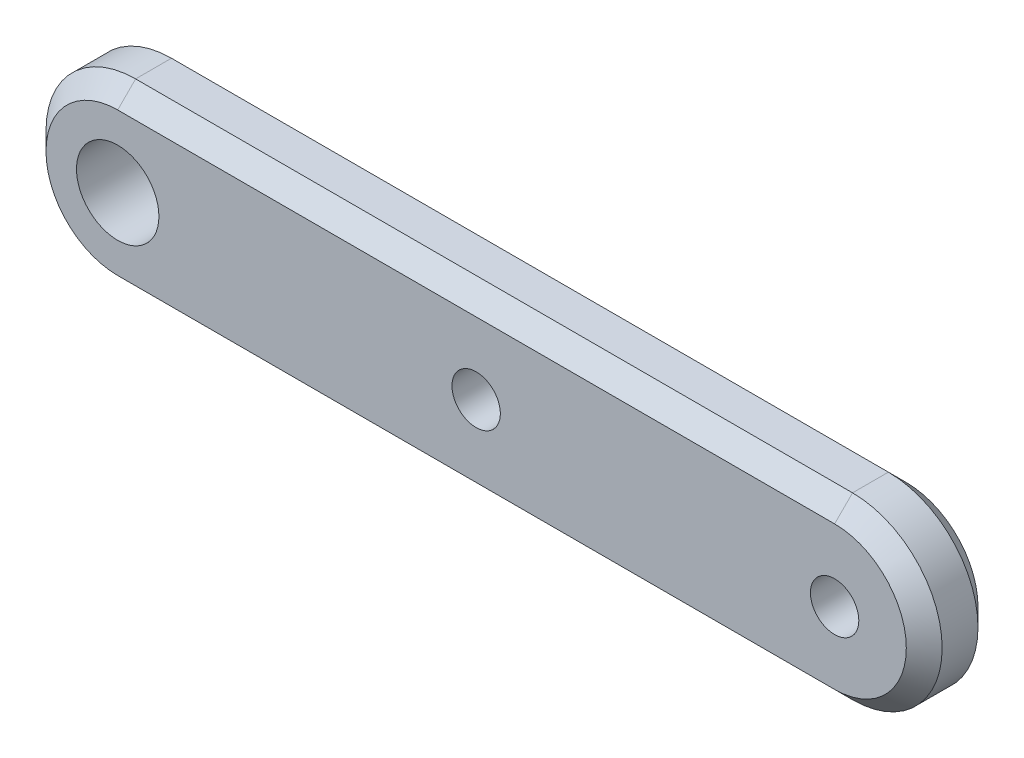
ISO-10303-21;
HEADER;
FILE_DESCRIPTION(('STEP AP214'),'2;1');
FILE_NAME('part.step','',(''),(''),'','','');
FILE_SCHEMA(('AUTOMOTIVE_DESIGN { 1 0 10303 214 1 1 1 1 }'));
ENDSEC;
DATA;
#1=APPLICATION_CONTEXT('core data for automotive mechanical design processes');
#2=APPLICATION_PROTOCOL_DEFINITION('international standard','automotive_design',2000,#1);
#3=PRODUCT_CONTEXT('',#1,'mechanical');
#4=PRODUCT('Part','Part','',(#3));
#5=PRODUCT_RELATED_PRODUCT_CATEGORY('part','',(#4));
#6=PRODUCT_DEFINITION_FORMATION('','',#4);
#7=PRODUCT_DEFINITION_CONTEXT('part definition',#1,'design');
#8=PRODUCT_DEFINITION('design','',#6,#7);
#9=PRODUCT_DEFINITION_SHAPE('','',#8);
#10=(LENGTH_UNIT() NAMED_UNIT(*) SI_UNIT(.MILLI.,.METRE.));
#11=(NAMED_UNIT(*) PLANE_ANGLE_UNIT() SI_UNIT($,.RADIAN.));
#12=(NAMED_UNIT(*) SI_UNIT($,.STERADIAN.) SOLID_ANGLE_UNIT());
#13=UNCERTAINTY_MEASURE_WITH_UNIT(LENGTH_MEASURE(1.E-05),#10,'distance_accuracy_value','');
#14=(GEOMETRIC_REPRESENTATION_CONTEXT(3) GLOBAL_UNCERTAINTY_ASSIGNED_CONTEXT((#13)) GLOBAL_UNIT_ASSIGNED_CONTEXT((#10,
#11,#12)) REPRESENTATION_CONTEXT('',''));
#15=CARTESIAN_POINT('',(0.,0.,0.));
#16=DIRECTION('',(0.,0.,1.));
#17=DIRECTION('',(1.,0.,0.));
#18=AXIS2_PLACEMENT_3D('',#15,#16,#17);
#19=CARTESIAN_POINT('',(0.,-5.,4.));
#20=DIRECTION('',(0.,-1.,0.));
#21=DIRECTION('',(0.,0.,-1.));
#22=AXIS2_PLACEMENT_3D('',#19,#20,#21);
#23=PLANE('',#22);
#24=DIRECTION('',(0.,0.,-1.));
#25=VECTOR('',#24,1.);
#26=CARTESIAN_POINT('',(0.,-5.,4.));
#27=LINE('',#26,#25);
#28=CARTESIAN_POINT('',(0.,-5.,3.));
#29=VERTEX_POINT('',#28);
#30=CARTESIAN_POINT('',(0.,-5.,1.));
#31=VERTEX_POINT('',#30);
#32=EDGE_CURVE('E183',#29,#31,#27,.T.);
#33=ORIENTED_EDGE('',*,*,#32,.T.);
#34=DIRECTION('',(1.,0.,0.));
#35=VECTOR('',#34,1.);
#36=CARTESIAN_POINT('',(40.,-5.,1.));
#37=LINE('',#36,#35);
#38=CARTESIAN_POINT('',(40.,-5.,1.));
#39=VERTEX_POINT('',#38);
#40=EDGE_CURVE('E167',#31,#39,#37,.T.);
#41=ORIENTED_EDGE('',*,*,#40,.T.);
#42=DIRECTION('',(0.,0.,-1.));
#43=VECTOR('',#42,1.);
#44=CARTESIAN_POINT('',(40.,-5.,4.));
#45=LINE('',#44,#43);
#46=CARTESIAN_POINT('',(40.,-5.,3.));
#47=VERTEX_POINT('',#46);
#48=EDGE_CURVE('E125',#47,#39,#45,.T.);
#49=ORIENTED_EDGE('',*,*,#48,.F.);
#50=DIRECTION('',(-1.,0.,0.));
#51=VECTOR('',#50,1.);
#52=CARTESIAN_POINT('',(0.,-5.,3.));
#53=LINE('',#52,#51);
#54=EDGE_CURVE('E170',#47,#29,#53,.T.);
#55=ORIENTED_EDGE('',*,*,#54,.T.);
#56=EDGE_LOOP('',(#33,#41,#49,#55));
#57=FACE_BOUND('',#56,.T.);
#58=ADVANCED_FACE('F36',(#57),#23,.T.);
#59=CARTESIAN_POINT('',(40.,0.,4.));
#60=DIRECTION('',(0.,0.,-1.));
#61=DIRECTION('',(-1.,0.,0.));
#62=AXIS2_PLACEMENT_3D('',#59,#60,#61);
#63=CYLINDRICAL_SURFACE('',#62,5.);
#64=ORIENTED_EDGE('',*,*,#48,.T.);
#65=CARTESIAN_POINT('',(40.,0.,1.));
#66=DIRECTION('',(0.,0.,1.));
#67=DIRECTION('',(1.,0.,0.));
#68=AXIS2_PLACEMENT_3D('',#65,#66,#67);
#69=CIRCLE('',#68,5.);
#70=CARTESIAN_POINT('',(40.,5.,1.));
#71=VERTEX_POINT('',#70);
#72=EDGE_CURVE('E160',#39,#71,#69,.T.);
#73=ORIENTED_EDGE('',*,*,#72,.T.);
#74=DIRECTION('',(0.,0.,-1.));
#75=VECTOR('',#74,1.);
#76=CARTESIAN_POINT('',(40.,5.,4.));
#77=LINE('',#76,#75);
#78=CARTESIAN_POINT('',(40.,5.,3.));
#79=VERTEX_POINT('',#78);
#80=EDGE_CURVE('E177',#79,#71,#77,.T.);
#81=ORIENTED_EDGE('',*,*,#80,.F.);
#82=CARTESIAN_POINT('',(40.,0.,3.));
#83=DIRECTION('',(0.,0.,1.));
#84=DIRECTION('',(1.,0.,0.));
#85=AXIS2_PLACEMENT_3D('',#82,#83,#84);
#86=CIRCLE('',#85,5.);
#87=EDGE_CURVE('E162',#79,#47,#86,.F.);
#88=ORIENTED_EDGE('',*,*,#87,.T.);
#89=EDGE_LOOP('',(#64,#73,#81,#88));
#90=FACE_BOUND('',#89,.T.);
#91=ADVANCED_FACE('F230',(#90),#63,.T.);
#92=CARTESIAN_POINT('',(0.,5.,4.));
#93=DIRECTION('',(0.,1.,0.));
#94=DIRECTION('',(0.,0.,1.));
#95=AXIS2_PLACEMENT_3D('',#92,#93,#94);
#96=PLANE('',#95);
#97=ORIENTED_EDGE('',*,*,#80,.T.);
#98=DIRECTION('',(-1.,0.,0.));
#99=VECTOR('',#98,1.);
#100=CARTESIAN_POINT('',(0.,5.,1.));
#101=LINE('',#100,#99);
#102=CARTESIAN_POINT('',(0.,5.,1.));
#103=VERTEX_POINT('',#102);
#104=EDGE_CURVE('E156',#71,#103,#101,.T.);
#105=ORIENTED_EDGE('',*,*,#104,.T.);
#106=DIRECTION('',(0.,0.,-1.));
#107=VECTOR('',#106,1.);
#108=CARTESIAN_POINT('',(0.,5.,4.));
#109=LINE('',#108,#107);
#110=CARTESIAN_POINT('',(0.,5.,3.));
#111=VERTEX_POINT('',#110);
#112=EDGE_CURVE('E180',#111,#103,#109,.T.);
#113=ORIENTED_EDGE('',*,*,#112,.F.);
#114=DIRECTION('',(1.,0.,0.));
#115=VECTOR('',#114,1.);
#116=CARTESIAN_POINT('',(0.,5.,3.));
#117=LINE('',#116,#115);
#118=EDGE_CURVE('E158',#111,#79,#117,.T.);
#119=ORIENTED_EDGE('',*,*,#118,.T.);
#120=EDGE_LOOP('',(#97,#105,#113,#119));
#121=FACE_BOUND('',#120,.T.);
#122=ADVANCED_FACE('F236',(#121),#96,.T.);
#123=CARTESIAN_POINT('',(40.,0.,4.));
#124=DIRECTION('',(0.,0.,-1.));
#125=DIRECTION('',(-1.,0.,0.));
#126=AXIS2_PLACEMENT_3D('',#123,#124,#125);
#127=CYLINDRICAL_SURFACE('',#126,1.35);
#128=CARTESIAN_POINT('',(40.,0.,4.));
#129=DIRECTION('',(0.,0.,1.));
#130=DIRECTION('',(1.,0.,0.));
#131=AXIS2_PLACEMENT_3D('',#128,#129,#130);
#132=CIRCLE('',#131,1.35);
#133=CARTESIAN_POINT('',(41.35,0.,4.));
#134=VERTEX_POINT('',#133);
#135=EDGE_CURVE('E198',#134,#134,#132,.T.);
#136=ORIENTED_EDGE('',*,*,#135,.T.);
#137=EDGE_LOOP('',(#136));
#138=FACE_BOUND('',#137,.T.);
#139=CARTESIAN_POINT('',(40.,0.,0.));
#140=DIRECTION('',(0.,0.,1.));
#141=DIRECTION('',(1.,0.,0.));
#142=AXIS2_PLACEMENT_3D('',#139,#140,#141);
#143=CIRCLE('',#142,1.35);
#144=CARTESIAN_POINT('',(41.35,0.,0.));
#145=VERTEX_POINT('',#144);
#146=EDGE_CURVE('E191',#145,#145,#143,.T.);
#147=ORIENTED_EDGE('',*,*,#146,.F.);
#148=EDGE_LOOP('',(#147));
#149=FACE_BOUND('',#148,.T.);
#150=ADVANCED_FACE('F278',(#138,#149),#127,.F.);
#151=CARTESIAN_POINT('',(20.,0.,4.));
#152=DIRECTION('',(0.,0.,-1.));
#153=DIRECTION('',(-1.,0.,0.));
#154=AXIS2_PLACEMENT_3D('',#151,#152,#153);
#155=CYLINDRICAL_SURFACE('',#154,1.35);
#156=CARTESIAN_POINT('',(20.,0.,4.));
#157=DIRECTION('',(0.,0.,1.));
#158=DIRECTION('',(1.,0.,0.));
#159=AXIS2_PLACEMENT_3D('',#156,#157,#158);
#160=CIRCLE('',#159,1.35);
#161=CARTESIAN_POINT('',(21.35,0.,4.));
#162=VERTEX_POINT('',#161);
#163=EDGE_CURVE('E190',#162,#162,#160,.T.);
#164=ORIENTED_EDGE('',*,*,#163,.T.);
#165=EDGE_LOOP('',(#164));
#166=FACE_BOUND('',#165,.T.);
#167=CARTESIAN_POINT('',(20.,0.,0.));
#168=DIRECTION('',(0.,0.,1.));
#169=DIRECTION('',(1.,0.,0.));
#170=AXIS2_PLACEMENT_3D('',#167,#168,#169);
#171=CIRCLE('',#170,1.35);
#172=CARTESIAN_POINT('',(21.35,0.,0.));
#173=VERTEX_POINT('',#172);
#174=EDGE_CURVE('E131',#173,#173,#171,.T.);
#175=ORIENTED_EDGE('',*,*,#174,.F.);
#176=EDGE_LOOP('',(#175));
#177=FACE_BOUND('',#176,.T.);
#178=ADVANCED_FACE('F204',(#166,#177),#155,.F.);
#179=CARTESIAN_POINT('',(0.,0.,4.));
#180=DIRECTION('',(0.,0.,-1.));
#181=DIRECTION('',(-1.,0.,0.));
#182=AXIS2_PLACEMENT_3D('',#179,#180,#181);
#183=CYLINDRICAL_SURFACE('',#182,5.);
#184=ORIENTED_EDGE('',*,*,#112,.T.);
#185=CARTESIAN_POINT('',(0.,0.,1.));
#186=DIRECTION('',(0.,0.,1.));
#187=DIRECTION('',(1.,0.,0.));
#188=AXIS2_PLACEMENT_3D('',#185,#186,#187);
#189=CIRCLE('',#188,5.);
#190=EDGE_CURVE('E128',#103,#31,#189,.T.);
#191=ORIENTED_EDGE('',*,*,#190,.T.);
#192=ORIENTED_EDGE('',*,*,#32,.F.);
#193=CARTESIAN_POINT('',(0.,0.,3.));
#194=DIRECTION('',(0.,0.,1.));
#195=DIRECTION('',(1.,0.,0.));
#196=AXIS2_PLACEMENT_3D('',#193,#194,#195);
#197=CIRCLE('',#196,5.);
#198=EDGE_CURVE('E165',#29,#111,#197,.F.);
#199=ORIENTED_EDGE('',*,*,#198,.T.);
#200=EDGE_LOOP('',(#184,#191,#192,#199));
#201=FACE_BOUND('',#200,.T.);
#202=ADVANCED_FACE('F218',(#201),#183,.T.);
#203=CARTESIAN_POINT('',(0.,0.,4.));
#204=DIRECTION('',(0.,0.,-1.));
#205=DIRECTION('',(-1.,0.,0.));
#206=AXIS2_PLACEMENT_3D('',#203,#204,#205);
#207=CYLINDRICAL_SURFACE('',#206,2.3);
#208=CARTESIAN_POINT('',(0.,0.,4.));
#209=DIRECTION('',(0.,0.,1.));
#210=DIRECTION('',(1.,0.,0.));
#211=AXIS2_PLACEMENT_3D('',#208,#209,#210);
#212=CIRCLE('',#211,2.3);
#213=CARTESIAN_POINT('',(2.3,0.,4.));
#214=VERTEX_POINT('',#213);
#215=EDGE_CURVE('E186',#214,#214,#212,.T.);
#216=ORIENTED_EDGE('',*,*,#215,.T.);
#217=EDGE_LOOP('',(#216));
#218=FACE_BOUND('',#217,.T.);
#219=CARTESIAN_POINT('',(0.,0.,0.));
#220=DIRECTION('',(0.,0.,1.));
#221=DIRECTION('',(1.,0.,0.));
#222=AXIS2_PLACEMENT_3D('',#219,#220,#221);
#223=CIRCLE('',#222,2.3);
#224=CARTESIAN_POINT('',(2.3,0.,0.));
#225=VERTEX_POINT('',#224);
#226=EDGE_CURVE('E187',#225,#225,#223,.T.);
#227=ORIENTED_EDGE('',*,*,#226,.F.);
#228=EDGE_LOOP('',(#227));
#229=FACE_BOUND('',#228,.T.);
#230=ADVANCED_FACE('F210',(#218,#229),#207,.F.);
#231=CARTESIAN_POINT('',(0.,0.,4.));
#232=DIRECTION('',(0.,0.,1.));
#233=DIRECTION('',(1.,0.,0.));
#234=AXIS2_PLACEMENT_3D('',#231,#232,#233);
#235=PLANE('',#234);
#236=CARTESIAN_POINT('',(0.,0.,4.));
#237=DIRECTION('',(0.,0.,1.));
#238=DIRECTION('',(1.,0.,0.));
#239=AXIS2_PLACEMENT_3D('',#236,#237,#238);
#240=CIRCLE('',#239,3.99999999999999);
#241=CARTESIAN_POINT('',(0.,3.99999999999999,4.));
#242=VERTEX_POINT('',#241);
#243=CARTESIAN_POINT('',(0.,-3.99999999999999,4.));
#244=VERTEX_POINT('',#243);
#245=EDGE_CURVE('E45',#242,#244,#240,.T.);
#246=ORIENTED_EDGE('',*,*,#245,.T.);
#247=DIRECTION('',(1.,0.,0.));
#248=VECTOR('',#247,1.);
#249=CARTESIAN_POINT('',(0.,-3.99999999999999,4.));
#250=LINE('',#249,#248);
#251=CARTESIAN_POINT('',(40.,-3.99999999999999,4.));
#252=VERTEX_POINT('',#251);
#253=EDGE_CURVE('E11',#244,#252,#250,.T.);
#254=ORIENTED_EDGE('',*,*,#253,.T.);
#255=CARTESIAN_POINT('',(40.,0.,4.));
#256=DIRECTION('',(0.,0.,1.));
#257=DIRECTION('',(1.,0.,0.));
#258=AXIS2_PLACEMENT_3D('',#255,#256,#257);
#259=CIRCLE('',#258,3.99999999999999);
#260=CARTESIAN_POINT('',(40.,3.99999999999999,4.));
#261=VERTEX_POINT('',#260);
#262=EDGE_CURVE('E152',#252,#261,#259,.T.);
#263=ORIENTED_EDGE('',*,*,#262,.T.);
#264=DIRECTION('',(-1.,0.,0.));
#265=VECTOR('',#264,1.);
#266=CARTESIAN_POINT('',(0.,3.99999999999999,4.));
#267=LINE('',#266,#265);
#268=EDGE_CURVE('E154',#261,#242,#267,.T.);
#269=ORIENTED_EDGE('',*,*,#268,.T.);
#270=EDGE_LOOP('',(#246,#254,#263,#269));
#271=FACE_BOUND('',#270,.T.);
#272=ORIENTED_EDGE('',*,*,#163,.F.);
#273=EDGE_LOOP('',(#272));
#274=FACE_BOUND('',#273,.T.);
#275=ORIENTED_EDGE('',*,*,#135,.F.);
#276=EDGE_LOOP('',(#275));
#277=FACE_BOUND('',#276,.T.);
#278=ORIENTED_EDGE('',*,*,#215,.F.);
#279=EDGE_LOOP('',(#278));
#280=FACE_BOUND('',#279,.T.);
#281=ADVANCED_FACE('F207',(#271,#274,#277,#280),#235,.T.);
#282=CARTESIAN_POINT('',(0.,0.,0.));
#283=DIRECTION('',(0.,0.,1.));
#284=DIRECTION('',(1.,0.,0.));
#285=AXIS2_PLACEMENT_3D('',#282,#283,#284);
#286=PLANE('',#285);
#287=CARTESIAN_POINT('',(40.,0.,0.));
#288=DIRECTION('',(0.,0.,1.));
#289=DIRECTION('',(1.,0.,0.));
#290=AXIS2_PLACEMENT_3D('',#287,#288,#289);
#291=CIRCLE('',#290,4.);
#292=CARTESIAN_POINT('',(40.,4.00000000000001,0.));
#293=VERTEX_POINT('',#292);
#294=CARTESIAN_POINT('',(40.,-4.,0.));
#295=VERTEX_POINT('',#294);
#296=EDGE_CURVE('E114',#293,#295,#291,.F.);
#297=ORIENTED_EDGE('',*,*,#296,.T.);
#298=DIRECTION('',(-1.,0.,0.));
#299=VECTOR('',#298,1.);
#300=CARTESIAN_POINT('',(0.,-4.00000000000001,0.));
#301=LINE('',#300,#299);
#302=CARTESIAN_POINT('',(0.,-4.00000000000001,0.));
#303=VERTEX_POINT('',#302);
#304=EDGE_CURVE('E110',#295,#303,#301,.T.);
#305=ORIENTED_EDGE('',*,*,#304,.T.);
#306=CARTESIAN_POINT('',(0.,0.,0.));
#307=DIRECTION('',(0.,0.,1.));
#308=DIRECTION('',(1.,0.,0.));
#309=AXIS2_PLACEMENT_3D('',#306,#307,#308);
#310=CIRCLE('',#309,4.00000000000001);
#311=CARTESIAN_POINT('',(0.,4.00000000000001,0.));
#312=VERTEX_POINT('',#311);
#313=EDGE_CURVE('E103',#303,#312,#310,.F.);
#314=ORIENTED_EDGE('',*,*,#313,.T.);
#315=DIRECTION('',(1.,0.,0.));
#316=VECTOR('',#315,1.);
#317=CARTESIAN_POINT('',(40.,4.00000000000001,0.));
#318=LINE('',#317,#316);
#319=EDGE_CURVE('E107',#312,#293,#318,.T.);
#320=ORIENTED_EDGE('',*,*,#319,.T.);
#321=EDGE_LOOP('',(#297,#305,#314,#320));
#322=FACE_BOUND('',#321,.T.);
#323=ORIENTED_EDGE('',*,*,#174,.T.);
#324=EDGE_LOOP('',(#323));
#325=FACE_BOUND('',#324,.T.);
#326=ORIENTED_EDGE('',*,*,#146,.T.);
#327=EDGE_LOOP('',(#326));
#328=FACE_BOUND('',#327,.T.);
#329=ORIENTED_EDGE('',*,*,#226,.T.);
#330=EDGE_LOOP('',(#329));
#331=FACE_BOUND('',#330,.T.);
#332=ADVANCED_FACE('F105',(#322,#325,#328,#331),#286,.F.);
#333=CARTESIAN_POINT('',(0.,4.00000000000001,0.));
#334=DIRECTION('',(0.,0.70710678118655,-0.707106781186545));
#335=DIRECTION('',(-1.,0.,0.));
#336=AXIS2_PLACEMENT_3D('',#333,#334,#335);
#337=PLANE('',#336);
#338=DIRECTION('',(0.,-0.707106781186545,-0.70710678118655));
#339=VECTOR('',#338,1.);
#340=CARTESIAN_POINT('',(0.,5.,1.));
#341=LINE('',#340,#339);
#342=EDGE_CURVE('E120',#103,#312,#341,.T.);
#343=ORIENTED_EDGE('',*,*,#342,.F.);
#344=ORIENTED_EDGE('',*,*,#104,.F.);
#345=DIRECTION('',(0.,0.707106781186545,0.70710678118655));
#346=VECTOR('',#345,1.);
#347=CARTESIAN_POINT('',(40.,4.00000000000001,0.));
#348=LINE('',#347,#346);
#349=EDGE_CURVE('E123',#293,#71,#348,.T.);
#350=ORIENTED_EDGE('',*,*,#349,.F.);
#351=ORIENTED_EDGE('',*,*,#319,.F.);
#352=EDGE_LOOP('',(#343,#344,#350,#351));
#353=FACE_BOUND('',#352,.T.);
#354=ADVANCED_FACE('F118',(#353),#337,.T.);
#355=CARTESIAN_POINT('',(40.,0.,1.));
#356=DIRECTION('',(0.,0.,1.));
#357=DIRECTION('',(1.,0.,0.));
#358=AXIS2_PLACEMENT_3D('',#355,#356,#357);
#359=CONICAL_SURFACE('',#358,5.,0.785398163397445);
#360=ORIENTED_EDGE('',*,*,#349,.T.);
#361=ORIENTED_EDGE('',*,*,#72,.F.);
#362=DIRECTION('',(0.,-0.707106781186545,0.70710678118655));
#363=VECTOR('',#362,1.);
#364=CARTESIAN_POINT('',(40.,-4.,0.));
#365=LINE('',#364,#363);
#366=EDGE_CURVE('E129',#295,#39,#365,.T.);
#367=ORIENTED_EDGE('',*,*,#366,.F.);
#368=ORIENTED_EDGE('',*,*,#296,.F.);
#369=EDGE_LOOP('',(#360,#361,#367,#368));
#370=FACE_BOUND('',#369,.T.);
#371=ADVANCED_FACE('F227',(#370),#359,.T.);
#372=CARTESIAN_POINT('',(0.,0.,1.));
#373=DIRECTION('',(0.,0.,1.));
#374=DIRECTION('',(1.,0.,0.));
#375=AXIS2_PLACEMENT_3D('',#372,#373,#374);
#376=CONICAL_SURFACE('',#375,5.,0.785398163397445);
#377=ORIENTED_EDGE('',*,*,#342,.T.);
#378=ORIENTED_EDGE('',*,*,#313,.F.);
#379=DIRECTION('',(0.,0.707106781186545,-0.70710678118655));
#380=VECTOR('',#379,1.);
#381=CARTESIAN_POINT('',(0.,-5.,1.));
#382=LINE('',#381,#380);
#383=EDGE_CURVE('E133',#31,#303,#382,.T.);
#384=ORIENTED_EDGE('',*,*,#383,.F.);
#385=ORIENTED_EDGE('',*,*,#190,.F.);
#386=EDGE_LOOP('',(#377,#378,#384,#385));
#387=FACE_BOUND('',#386,.T.);
#388=ADVANCED_FACE('F127',(#387),#376,.T.);
#389=CARTESIAN_POINT('',(0.,-4.00000000000001,0.));
#390=DIRECTION('',(0.,-0.70710678118655,-0.707106781186545));
#391=DIRECTION('',(1.,0.,0.));
#392=AXIS2_PLACEMENT_3D('',#389,#390,#391);
#393=PLANE('',#392);
#394=ORIENTED_EDGE('',*,*,#366,.T.);
#395=ORIENTED_EDGE('',*,*,#40,.F.);
#396=ORIENTED_EDGE('',*,*,#383,.T.);
#397=ORIENTED_EDGE('',*,*,#304,.F.);
#398=EDGE_LOOP('',(#394,#395,#396,#397));
#399=FACE_BOUND('',#398,.T.);
#400=ADVANCED_FACE('F241',(#399),#393,.T.);
#401=CARTESIAN_POINT('',(0.,5.,3.));
#402=DIRECTION('',(0.,-0.707106781186545,-0.70710678118655));
#403=DIRECTION('',(1.,0.,0.));
#404=AXIS2_PLACEMENT_3D('',#401,#402,#403);
#405=PLANE('',#404);
#406=DIRECTION('',(0.,0.70710678118655,-0.707106781186545));
#407=VECTOR('',#406,1.);
#408=CARTESIAN_POINT('',(0.,3.99999999999999,4.));
#409=LINE('',#408,#407);
#410=EDGE_CURVE('E139',#242,#111,#409,.T.);
#411=ORIENTED_EDGE('',*,*,#410,.F.);
#412=ORIENTED_EDGE('',*,*,#268,.F.);
#413=DIRECTION('',(0.,-0.70710678118655,0.707106781186545));
#414=VECTOR('',#413,1.);
#415=CARTESIAN_POINT('',(40.,5.,3.));
#416=LINE('',#415,#414);
#417=EDGE_CURVE('E40',#79,#261,#416,.T.);
#418=ORIENTED_EDGE('',*,*,#417,.F.);
#419=ORIENTED_EDGE('',*,*,#118,.F.);
#420=EDGE_LOOP('',(#411,#412,#418,#419));
#421=FACE_BOUND('',#420,.T.);
#422=ADVANCED_FACE('F38',(#421),#405,.F.);
#423=CARTESIAN_POINT('',(40.,0.,4.));
#424=DIRECTION('',(0.,0.,-1.));
#425=DIRECTION('',(-1.,0.,0.));
#426=AXIS2_PLACEMENT_3D('',#423,#424,#425);
#427=CONICAL_SURFACE('',#426,3.99999999999999,0.785398163397452);
#428=ORIENTED_EDGE('',*,*,#417,.T.);
#429=ORIENTED_EDGE('',*,*,#262,.F.);
#430=DIRECTION('',(0.,0.70710678118655,0.707106781186545));
#431=VECTOR('',#430,1.);
#432=CARTESIAN_POINT('',(40.,-5.,3.));
#433=LINE('',#432,#431);
#434=EDGE_CURVE('E58',#47,#252,#433,.T.);
#435=ORIENTED_EDGE('',*,*,#434,.F.);
#436=ORIENTED_EDGE('',*,*,#87,.F.);
#437=EDGE_LOOP('',(#428,#429,#435,#436));
#438=FACE_BOUND('',#437,.T.);
#439=ADVANCED_FACE('F254',(#438),#427,.T.);
#440=CARTESIAN_POINT('',(0.,0.,4.));
#441=DIRECTION('',(0.,0.,-1.));
#442=DIRECTION('',(-1.,0.,0.));
#443=AXIS2_PLACEMENT_3D('',#440,#441,#442);
#444=CONICAL_SURFACE('',#443,3.99999999999999,0.785398163397452);
#445=ORIENTED_EDGE('',*,*,#410,.T.);
#446=ORIENTED_EDGE('',*,*,#198,.F.);
#447=DIRECTION('',(0.,-0.70710678118655,-0.707106781186545));
#448=VECTOR('',#447,1.);
#449=CARTESIAN_POINT('',(0.,-3.99999999999999,4.));
#450=LINE('',#449,#448);
#451=EDGE_CURVE('E137',#244,#29,#450,.T.);
#452=ORIENTED_EDGE('',*,*,#451,.F.);
#453=ORIENTED_EDGE('',*,*,#245,.F.);
#454=EDGE_LOOP('',(#445,#446,#452,#453));
#455=FACE_BOUND('',#454,.T.);
#456=ADVANCED_FACE('F252',(#455),#444,.T.);
#457=CARTESIAN_POINT('',(0.,-5.,3.));
#458=DIRECTION('',(0.,0.707106781186545,-0.70710678118655));
#459=DIRECTION('',(-1.,0.,0.));
#460=AXIS2_PLACEMENT_3D('',#457,#458,#459);
#461=PLANE('',#460);
#462=ORIENTED_EDGE('',*,*,#434,.T.);
#463=ORIENTED_EDGE('',*,*,#253,.F.);
#464=ORIENTED_EDGE('',*,*,#451,.T.);
#465=ORIENTED_EDGE('',*,*,#54,.F.);
#466=EDGE_LOOP('',(#462,#463,#464,#465));
#467=FACE_BOUND('',#466,.T.);
#468=ADVANCED_FACE('F249',(#467),#461,.F.);
#469=CLOSED_SHELL('',(#58,#91,#122,#150,#178,#202,#230,#281,#332,#354,#371,#388,#400,#422,#439,
#456,#468));
#470=MANIFOLD_SOLID_BREP('B2',#469);
#471=ADVANCED_BREP_SHAPE_REPRESENTATION('',(#18,#470),#14);
#472=SHAPE_DEFINITION_REPRESENTATION(#9,#471);
ENDSEC;
END-ISO-10303-21;
